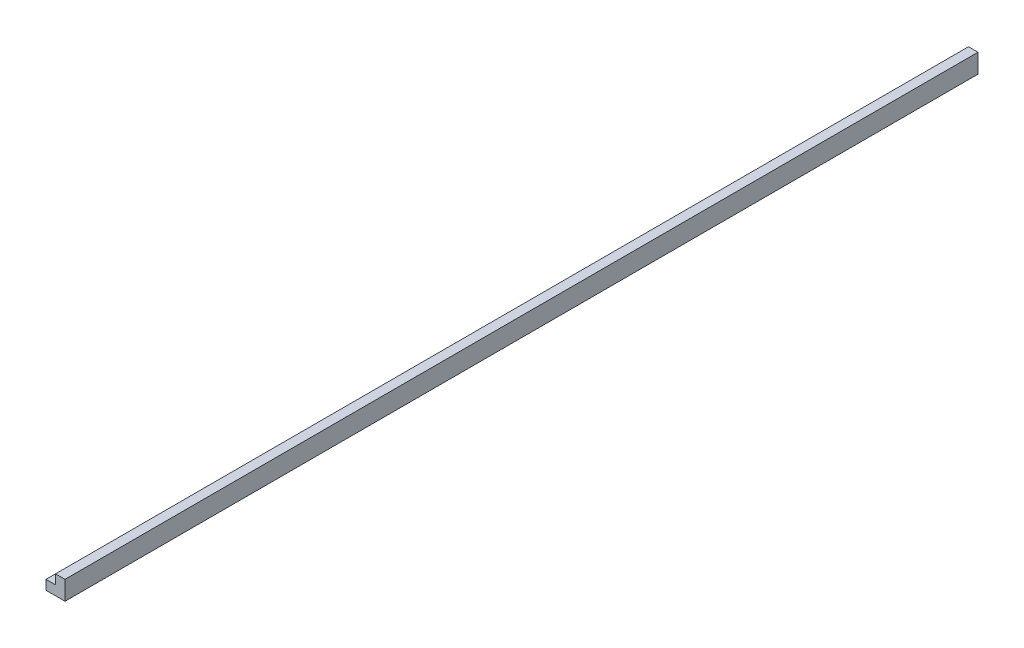
ISO-10303-21;
HEADER;
FILE_DESCRIPTION(('STEP AP214'),'2;1');
FILE_NAME('part.step','',(''),(''),'','','');
FILE_SCHEMA(('AUTOMOTIVE_DESIGN { 1 0 10303 214 1 1 1 1 }'));
ENDSEC;
DATA;
#1=APPLICATION_CONTEXT('core data for automotive mechanical design processes');
#2=APPLICATION_PROTOCOL_DEFINITION('international standard','automotive_design',2000,#1);
#3=PRODUCT_CONTEXT('',#1,'mechanical');
#4=PRODUCT('Part','Part','',(#3));
#5=PRODUCT_RELATED_PRODUCT_CATEGORY('part','',(#4));
#6=PRODUCT_DEFINITION_FORMATION('','',#4);
#7=PRODUCT_DEFINITION_CONTEXT('part definition',#1,'design');
#8=PRODUCT_DEFINITION('design','',#6,#7);
#9=PRODUCT_DEFINITION_SHAPE('','',#8);
#10=(LENGTH_UNIT() NAMED_UNIT(*) SI_UNIT(.MILLI.,.METRE.));
#11=(NAMED_UNIT(*) PLANE_ANGLE_UNIT() SI_UNIT($,.RADIAN.));
#12=(NAMED_UNIT(*) SI_UNIT($,.STERADIAN.) SOLID_ANGLE_UNIT());
#13=UNCERTAINTY_MEASURE_WITH_UNIT(LENGTH_MEASURE(1.E-05),#10,'distance_accuracy_value','');
#14=(GEOMETRIC_REPRESENTATION_CONTEXT(3) GLOBAL_UNCERTAINTY_ASSIGNED_CONTEXT((#13)) GLOBAL_UNIT_ASSIGNED_CONTEXT((#10,
#11,#12)) REPRESENTATION_CONTEXT('',''));
#15=CARTESIAN_POINT('',(0.,0.,0.));
#16=DIRECTION('',(0.,0.,1.));
#17=DIRECTION('',(1.,0.,0.));
#18=AXIS2_PLACEMENT_3D('',#15,#16,#17);
#19=CARTESIAN_POINT('',(-12.7,0.,304.8));
#20=DIRECTION('',(1.,0.,0.));
#21=DIRECTION('',(0.,0.,-1.));
#22=AXIS2_PLACEMENT_3D('',#19,#20,#21);
#23=PLANE('',#22);
#24=DIRECTION('',(0.,0.,-1.));
#25=VECTOR('',#24,1.);
#26=CARTESIAN_POINT('',(-12.7,6.35,304.8));
#27=LINE('',#26,#25);
#28=CARTESIAN_POINT('',(-12.7,6.35,304.8));
#29=VERTEX_POINT('',#28);
#30=CARTESIAN_POINT('',(-12.7,6.35,-304.8));
#31=VERTEX_POINT('',#30);
#32=EDGE_CURVE('E102',#29,#31,#27,.T.);
#33=ORIENTED_EDGE('',*,*,#32,.T.);
#34=DIRECTION('',(0.,-1.,0.));
#35=VECTOR('',#34,1.);
#36=CARTESIAN_POINT('',(-12.7,0.,-304.8));
#37=LINE('',#36,#35);
#38=CARTESIAN_POINT('',(-12.7,0.,-304.8));
#39=VERTEX_POINT('',#38);
#40=EDGE_CURVE('E96',#31,#39,#37,.T.);
#41=ORIENTED_EDGE('',*,*,#40,.T.);
#42=DIRECTION('',(0.,0.,-1.));
#43=VECTOR('',#42,1.);
#44=CARTESIAN_POINT('',(-12.7,0.,304.8));
#45=LINE('',#44,#43);
#46=CARTESIAN_POINT('',(-12.7,0.,304.8));
#47=VERTEX_POINT('',#46);
#48=EDGE_CURVE('E11',#47,#39,#45,.T.);
#49=ORIENTED_EDGE('',*,*,#48,.F.);
#50=DIRECTION('',(0.,-1.,0.));
#51=VECTOR('',#50,1.);
#52=CARTESIAN_POINT('',(-12.7,0.,304.8));
#53=LINE('',#52,#51);
#54=EDGE_CURVE('E114',#29,#47,#53,.T.);
#55=ORIENTED_EDGE('',*,*,#54,.F.);
#56=EDGE_LOOP('',(#33,#41,#49,#55));
#57=FACE_BOUND('',#56,.T.);
#58=ADVANCED_FACE('F32',(#57),#23,.F.);
#59=CARTESIAN_POINT('',(-12.7,0.,304.8));
#60=DIRECTION('',(0.,1.,0.));
#61=DIRECTION('',(0.,0.,1.));
#62=AXIS2_PLACEMENT_3D('',#59,#60,#61);
#63=PLANE('',#62);
#64=ORIENTED_EDGE('',*,*,#48,.T.);
#65=DIRECTION('',(1.,0.,0.));
#66=VECTOR('',#65,1.);
#67=CARTESIAN_POINT('',(-12.7,0.,-304.8));
#68=LINE('',#67,#66);
#69=CARTESIAN_POINT('',(0.,0.,-304.8));
#70=VERTEX_POINT('',#69);
#71=EDGE_CURVE('E86',#39,#70,#68,.T.);
#72=ORIENTED_EDGE('',*,*,#71,.T.);
#73=DIRECTION('',(0.,0.,-1.));
#74=VECTOR('',#73,1.);
#75=CARTESIAN_POINT('',(0.,0.,304.8));
#76=LINE('',#75,#74);
#77=CARTESIAN_POINT('',(0.,0.,304.8));
#78=VERTEX_POINT('',#77);
#79=EDGE_CURVE('E39',#78,#70,#76,.T.);
#80=ORIENTED_EDGE('',*,*,#79,.F.);
#81=DIRECTION('',(1.,0.,0.));
#82=VECTOR('',#81,1.);
#83=CARTESIAN_POINT('',(-12.7,0.,304.8));
#84=LINE('',#83,#82);
#85=EDGE_CURVE('E87',#47,#78,#84,.T.);
#86=ORIENTED_EDGE('',*,*,#85,.F.);
#87=EDGE_LOOP('',(#64,#72,#80,#86));
#88=FACE_BOUND('',#87,.T.);
#89=ADVANCED_FACE('F84',(#88),#63,.F.);
#90=CARTESIAN_POINT('',(0.,0.,304.8));
#91=DIRECTION('',(-1.,0.,0.));
#92=DIRECTION('',(0.,0.,1.));
#93=AXIS2_PLACEMENT_3D('',#90,#91,#92);
#94=PLANE('',#93);
#95=ORIENTED_EDGE('',*,*,#79,.T.);
#96=DIRECTION('',(0.,1.,0.));
#97=VECTOR('',#96,1.);
#98=CARTESIAN_POINT('',(0.,0.,-304.8));
#99=LINE('',#98,#97);
#100=CARTESIAN_POINT('',(0.,12.7,-304.8));
#101=VERTEX_POINT('',#100);
#102=EDGE_CURVE('E100',#70,#101,#99,.T.);
#103=ORIENTED_EDGE('',*,*,#102,.T.);
#104=DIRECTION('',(0.,0.,-1.));
#105=VECTOR('',#104,1.);
#106=CARTESIAN_POINT('',(0.,12.7,304.8));
#107=LINE('',#106,#105);
#108=CARTESIAN_POINT('',(0.,12.7,304.8));
#109=VERTEX_POINT('',#108);
#110=EDGE_CURVE('E128',#109,#101,#107,.T.);
#111=ORIENTED_EDGE('',*,*,#110,.F.);
#112=DIRECTION('',(0.,1.,0.));
#113=VECTOR('',#112,1.);
#114=CARTESIAN_POINT('',(0.,0.,304.8));
#115=LINE('',#114,#113);
#116=EDGE_CURVE('E117',#78,#109,#115,.T.);
#117=ORIENTED_EDGE('',*,*,#116,.F.);
#118=EDGE_LOOP('',(#95,#103,#111,#117));
#119=FACE_BOUND('',#118,.T.);
#120=ADVANCED_FACE('F131',(#119),#94,.F.);
#121=CARTESIAN_POINT('',(0.,12.7,304.8));
#122=DIRECTION('',(0.,-1.,0.));
#123=DIRECTION('',(0.,0.,-1.));
#124=AXIS2_PLACEMENT_3D('',#121,#122,#123);
#125=PLANE('',#124);
#126=ORIENTED_EDGE('',*,*,#110,.T.);
#127=DIRECTION('',(-1.,0.,0.));
#128=VECTOR('',#127,1.);
#129=CARTESIAN_POINT('',(0.,12.7,-304.8));
#130=LINE('',#129,#128);
#131=CARTESIAN_POINT('',(-6.35,12.7,-304.8));
#132=VERTEX_POINT('',#131);
#133=EDGE_CURVE('E106',#101,#132,#130,.T.);
#134=ORIENTED_EDGE('',*,*,#133,.T.);
#135=DIRECTION('',(0.,0.,-1.));
#136=VECTOR('',#135,1.);
#137=CARTESIAN_POINT('',(-6.35,12.7,304.8));
#138=LINE('',#137,#136);
#139=CARTESIAN_POINT('',(-6.35,12.7,304.8));
#140=VERTEX_POINT('',#139);
#141=EDGE_CURVE('E126',#140,#132,#138,.T.);
#142=ORIENTED_EDGE('',*,*,#141,.F.);
#143=DIRECTION('',(-1.,0.,0.));
#144=VECTOR('',#143,1.);
#145=CARTESIAN_POINT('',(0.,12.7,304.8));
#146=LINE('',#145,#144);
#147=EDGE_CURVE('E119',#109,#140,#146,.T.);
#148=ORIENTED_EDGE('',*,*,#147,.F.);
#149=EDGE_LOOP('',(#126,#134,#142,#148));
#150=FACE_BOUND('',#149,.T.);
#151=ADVANCED_FACE('F137',(#150),#125,.F.);
#152=CARTESIAN_POINT('',(-6.35,12.7,304.8));
#153=DIRECTION('',(1.,0.,0.));
#154=DIRECTION('',(0.,1.,0.));
#155=AXIS2_PLACEMENT_3D('',#152,#153,#154);
#156=PLANE('',#155);
#157=ORIENTED_EDGE('',*,*,#141,.T.);
#158=DIRECTION('',(0.,-1.,0.));
#159=VECTOR('',#158,1.);
#160=CARTESIAN_POINT('',(-6.35,12.7,-304.8));
#161=LINE('',#160,#159);
#162=CARTESIAN_POINT('',(-6.34999999999999,6.35,-304.8));
#163=VERTEX_POINT('',#162);
#164=EDGE_CURVE('E109',#132,#163,#161,.T.);
#165=ORIENTED_EDGE('',*,*,#164,.T.);
#166=DIRECTION('',(0.,0.,-1.));
#167=VECTOR('',#166,1.);
#168=CARTESIAN_POINT('',(-6.34999999999999,6.35,304.8));
#169=LINE('',#168,#167);
#170=CARTESIAN_POINT('',(-6.34999999999999,6.35,304.8));
#171=VERTEX_POINT('',#170);
#172=EDGE_CURVE('E124',#171,#163,#169,.T.);
#173=ORIENTED_EDGE('',*,*,#172,.F.);
#174=DIRECTION('',(0.,-1.,0.));
#175=VECTOR('',#174,1.);
#176=CARTESIAN_POINT('',(-6.35,12.7,304.8));
#177=LINE('',#176,#175);
#178=EDGE_CURVE('E51',#140,#171,#177,.T.);
#179=ORIENTED_EDGE('',*,*,#178,.F.);
#180=EDGE_LOOP('',(#157,#165,#173,#179));
#181=FACE_BOUND('',#180,.T.);
#182=ADVANCED_FACE('F140',(#181),#156,.F.);
#183=CARTESIAN_POINT('',(-6.34999999999999,6.35,304.8));
#184=DIRECTION('',(0.,-1.,0.));
#185=DIRECTION('',(1.,0.,0.));
#186=AXIS2_PLACEMENT_3D('',#183,#184,#185);
#187=PLANE('',#186);
#188=ORIENTED_EDGE('',*,*,#172,.T.);
#189=DIRECTION('',(-1.,0.,0.));
#190=VECTOR('',#189,1.);
#191=CARTESIAN_POINT('',(-6.34999999999999,6.35,-304.8));
#192=LINE('',#191,#190);
#193=EDGE_CURVE('E112',#163,#31,#192,.T.);
#194=ORIENTED_EDGE('',*,*,#193,.T.);
#195=ORIENTED_EDGE('',*,*,#32,.F.);
#196=DIRECTION('',(-1.,0.,0.));
#197=VECTOR('',#196,1.);
#198=CARTESIAN_POINT('',(-6.34999999999999,6.35,304.8));
#199=LINE('',#198,#197);
#200=EDGE_CURVE('E46',#171,#29,#199,.T.);
#201=ORIENTED_EDGE('',*,*,#200,.F.);
#202=EDGE_LOOP('',(#188,#194,#195,#201));
#203=FACE_BOUND('',#202,.T.);
#204=ADVANCED_FACE('F142',(#203),#187,.F.);
#205=CARTESIAN_POINT('',(0.,0.,304.8));
#206=DIRECTION('',(0.,0.,1.));
#207=DIRECTION('',(1.,0.,0.));
#208=AXIS2_PLACEMENT_3D('',#205,#206,#207);
#209=PLANE('',#208);
#210=ORIENTED_EDGE('',*,*,#54,.T.);
#211=ORIENTED_EDGE('',*,*,#85,.T.);
#212=ORIENTED_EDGE('',*,*,#116,.T.);
#213=ORIENTED_EDGE('',*,*,#147,.T.);
#214=ORIENTED_EDGE('',*,*,#178,.T.);
#215=ORIENTED_EDGE('',*,*,#200,.T.);
#216=EDGE_LOOP('',(#210,#211,#212,#213,#214,#215));
#217=FACE_BOUND('',#216,.T.);
#218=ADVANCED_FACE('F134',(#217),#209,.T.);
#219=CARTESIAN_POINT('',(0.,0.,-304.8));
#220=DIRECTION('',(0.,0.,1.));
#221=DIRECTION('',(1.,0.,0.));
#222=AXIS2_PLACEMENT_3D('',#219,#220,#221);
#223=PLANE('',#222);
#224=ORIENTED_EDGE('',*,*,#40,.F.);
#225=ORIENTED_EDGE('',*,*,#193,.F.);
#226=ORIENTED_EDGE('',*,*,#164,.F.);
#227=ORIENTED_EDGE('',*,*,#133,.F.);
#228=ORIENTED_EDGE('',*,*,#102,.F.);
#229=ORIENTED_EDGE('',*,*,#71,.F.);
#230=EDGE_LOOP('',(#224,#225,#226,#227,#228,#229));
#231=FACE_BOUND('',#230,.T.);
#232=ADVANCED_FACE('F94',(#231),#223,.F.);
#233=CLOSED_SHELL('',(#58,#89,#120,#151,#182,#204,#218,#232));
#234=MANIFOLD_SOLID_BREP('B2',#233);
#235=ADVANCED_BREP_SHAPE_REPRESENTATION('',(#18,#234),#14);
#236=SHAPE_DEFINITION_REPRESENTATION(#9,#235);
ENDSEC;
END-ISO-10303-21;
